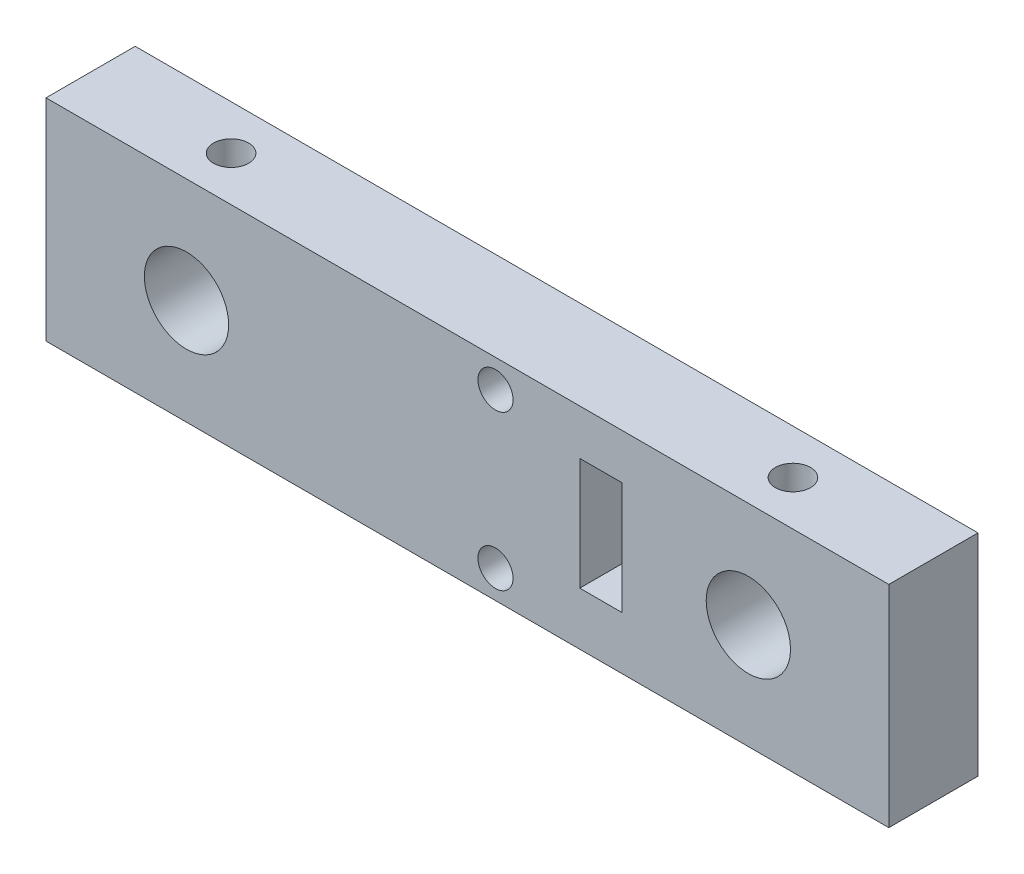
ISO-10303-21;
HEADER;
FILE_DESCRIPTION(('STEP AP214'),'2;1');
FILE_NAME('part.step','',(''),(''),'','','');
FILE_SCHEMA(('AUTOMOTIVE_DESIGN { 1 0 10303 214 1 1 1 1 }'));
ENDSEC;
DATA;
#1=APPLICATION_CONTEXT('core data for automotive mechanical design processes');
#2=APPLICATION_PROTOCOL_DEFINITION('international standard','automotive_design',2000,#1);
#3=PRODUCT_CONTEXT('',#1,'mechanical');
#4=PRODUCT('Part','Part','',(#3));
#5=PRODUCT_RELATED_PRODUCT_CATEGORY('part','',(#4));
#6=PRODUCT_DEFINITION_FORMATION('','',#4);
#7=PRODUCT_DEFINITION_CONTEXT('part definition',#1,'design');
#8=PRODUCT_DEFINITION('design','',#6,#7);
#9=PRODUCT_DEFINITION_SHAPE('','',#8);
#10=(LENGTH_UNIT() NAMED_UNIT(*) SI_UNIT(.MILLI.,.METRE.));
#11=(NAMED_UNIT(*) PLANE_ANGLE_UNIT() SI_UNIT($,.RADIAN.));
#12=(NAMED_UNIT(*) SI_UNIT($,.STERADIAN.) SOLID_ANGLE_UNIT());
#13=UNCERTAINTY_MEASURE_WITH_UNIT(LENGTH_MEASURE(1.E-05),#10,'distance_accuracy_value','');
#14=(GEOMETRIC_REPRESENTATION_CONTEXT(3) GLOBAL_UNCERTAINTY_ASSIGNED_CONTEXT((#13)) GLOBAL_UNIT_ASSIGNED_CONTEXT((#10,
#11,#12)) REPRESENTATION_CONTEXT('',''));
#15=CARTESIAN_POINT('',(0.,0.,0.));
#16=DIRECTION('',(0.,0.,1.));
#17=DIRECTION('',(1.,0.,0.));
#18=AXIS2_PLACEMENT_3D('',#15,#16,#17);
#19=CARTESIAN_POINT('',(0.,15.,6.35));
#20=DIRECTION('',(0.,0.,-1.));
#21=DIRECTION('',(-1.,0.,0.));
#22=AXIS2_PLACEMENT_3D('',#19,#20,#21);
#23=PLANE('',#22);
#24=CARTESIAN_POINT('',(32.,2.,6.35));
#25=DIRECTION('',(0.,0.,1.));
#26=DIRECTION('',(1.,0.,0.));
#27=AXIS2_PLACEMENT_3D('',#24,#25,#26);
#28=CIRCLE('',#27,1.24999999999999);
#29=CARTESIAN_POINT('',(33.25,2.,6.35));
#30=VERTEX_POINT('',#29);
#31=EDGE_CURVE('E279',#30,#30,#28,.T.);
#32=ORIENTED_EDGE('',*,*,#31,.F.);
#33=EDGE_LOOP('',(#32));
#34=FACE_BOUND('',#33,.T.);
#35=DIRECTION('',(1.,0.,0.));
#36=VECTOR('',#35,1.);
#37=CARTESIAN_POINT('',(38.,3.76931074562404,6.35));
#38=LINE('',#37,#36);
#39=CARTESIAN_POINT('',(38.,3.76931074562404,6.35));
#40=VERTEX_POINT('',#39);
#41=CARTESIAN_POINT('',(41.,3.76931074562404,6.35));
#42=VERTEX_POINT('',#41);
#43=EDGE_CURVE('E138',#40,#42,#38,.T.);
#44=ORIENTED_EDGE('',*,*,#43,.F.);
#45=DIRECTION('',(0.,-1.,0.));
#46=VECTOR('',#45,1.);
#47=CARTESIAN_POINT('',(38.,11.769310745624,6.35));
#48=LINE('',#47,#46);
#49=CARTESIAN_POINT('',(38.,11.769310745624,6.35));
#50=VERTEX_POINT('',#49);
#51=EDGE_CURVE('E58',#50,#40,#48,.T.);
#52=ORIENTED_EDGE('',*,*,#51,.F.);
#53=DIRECTION('',(-1.,0.,0.));
#54=VECTOR('',#53,1.);
#55=CARTESIAN_POINT('',(38.,11.769310745624,6.35));
#56=LINE('',#55,#54);
#57=CARTESIAN_POINT('',(41.,11.769310745624,6.35));
#58=VERTEX_POINT('',#57);
#59=EDGE_CURVE('E126',#58,#50,#56,.T.);
#60=ORIENTED_EDGE('',*,*,#59,.F.);
#61=DIRECTION('',(0.,1.,0.));
#62=VECTOR('',#61,1.);
#63=CARTESIAN_POINT('',(41.,11.769310745624,6.35));
#64=LINE('',#63,#62);
#65=EDGE_CURVE('E129',#42,#58,#64,.T.);
#66=ORIENTED_EDGE('',*,*,#65,.F.);
#67=EDGE_LOOP('',(#44,#52,#60,#66));
#68=FACE_BOUND('',#67,.T.);
#69=CARTESIAN_POINT('',(10.,7.5,6.35));
#70=DIRECTION('',(0.,0.,1.));
#71=DIRECTION('',(1.,0.,0.));
#72=AXIS2_PLACEMENT_3D('',#69,#70,#71);
#73=CIRCLE('',#72,3.);
#74=CARTESIAN_POINT('',(13.,7.5,6.35));
#75=VERTEX_POINT('',#74);
#76=EDGE_CURVE('E161',#75,#75,#73,.T.);
#77=ORIENTED_EDGE('',*,*,#76,.F.);
#78=EDGE_LOOP('',(#77));
#79=FACE_BOUND('',#78,.T.);
#80=DIRECTION('',(0.,-1.,0.));
#81=VECTOR('',#80,1.);
#82=CARTESIAN_POINT('',(0.,0.,6.35));
#83=LINE('',#82,#81);
#84=CARTESIAN_POINT('',(0.,15.,6.35));
#85=VERTEX_POINT('',#84);
#86=CARTESIAN_POINT('',(0.,0.,6.35));
#87=VERTEX_POINT('',#86);
#88=EDGE_CURVE('E167',#85,#87,#83,.T.);
#89=ORIENTED_EDGE('',*,*,#88,.T.);
#90=DIRECTION('',(1.,0.,0.));
#91=VECTOR('',#90,1.);
#92=CARTESIAN_POINT('',(0.,0.,6.35));
#93=LINE('',#92,#91);
#94=CARTESIAN_POINT('',(60.,0.,6.35));
#95=VERTEX_POINT('',#94);
#96=EDGE_CURVE('E170',#87,#95,#93,.T.);
#97=ORIENTED_EDGE('',*,*,#96,.T.);
#98=DIRECTION('',(0.,1.,0.));
#99=VECTOR('',#98,1.);
#100=CARTESIAN_POINT('',(60.,0.,6.35));
#101=LINE('',#100,#99);
#102=CARTESIAN_POINT('',(60.,15.,6.35));
#103=VERTEX_POINT('',#102);
#104=EDGE_CURVE('E173',#95,#103,#101,.T.);
#105=ORIENTED_EDGE('',*,*,#104,.T.);
#106=DIRECTION('',(-1.,0.,0.));
#107=VECTOR('',#106,1.);
#108=CARTESIAN_POINT('',(0.,15.,6.35));
#109=LINE('',#108,#107);
#110=EDGE_CURVE('E175',#103,#85,#109,.T.);
#111=ORIENTED_EDGE('',*,*,#110,.T.);
#112=EDGE_LOOP('',(#89,#97,#105,#111));
#113=FACE_BOUND('',#112,.T.);
#114=CARTESIAN_POINT('',(50.,7.5,6.35));
#115=DIRECTION('',(0.,0.,1.));
#116=DIRECTION('',(-1.,0.,0.));
#117=AXIS2_PLACEMENT_3D('',#114,#115,#116);
#118=CIRCLE('',#117,3.00000000000001);
#119=CARTESIAN_POINT('',(47.,7.5,6.35));
#120=VERTEX_POINT('',#119);
#121=EDGE_CURVE('E154',#120,#120,#118,.T.);
#122=ORIENTED_EDGE('',*,*,#121,.F.);
#123=EDGE_LOOP('',(#122));
#124=FACE_BOUND('',#123,.T.);
#125=CARTESIAN_POINT('',(32.,13.,6.35));
#126=DIRECTION('',(0.,0.,1.));
#127=DIRECTION('',(1.,0.,0.));
#128=AXIS2_PLACEMENT_3D('',#125,#126,#127);
#129=CIRCLE('',#128,1.24999999999999);
#130=CARTESIAN_POINT('',(33.25,13.,6.35));
#131=VERTEX_POINT('',#130);
#132=EDGE_CURVE('E275',#131,#131,#129,.T.);
#133=ORIENTED_EDGE('',*,*,#132,.F.);
#134=EDGE_LOOP('',(#133));
#135=FACE_BOUND('',#134,.T.);
#136=ADVANCED_FACE('F37',(#34,#68,#79,#113,#124,#135),#23,.F.);
#137=CARTESIAN_POINT('',(0.,15.,0.));
#138=DIRECTION('',(0.,0.,-1.));
#139=DIRECTION('',(-1.,0.,0.));
#140=AXIS2_PLACEMENT_3D('',#137,#138,#139);
#141=PLANE('',#140);
#142=CARTESIAN_POINT('',(32.,2.,0.));
#143=DIRECTION('',(0.,0.,1.));
#144=DIRECTION('',(1.,0.,0.));
#145=AXIS2_PLACEMENT_3D('',#142,#143,#144);
#146=CIRCLE('',#145,1.25);
#147=CARTESIAN_POINT('',(33.25,2.,0.));
#148=VERTEX_POINT('',#147);
#149=EDGE_CURVE('E132',#148,#148,#146,.T.);
#150=ORIENTED_EDGE('',*,*,#149,.T.);
#151=EDGE_LOOP('',(#150));
#152=FACE_BOUND('',#151,.T.);
#153=DIRECTION('',(0.,-1.,0.));
#154=VECTOR('',#153,1.);
#155=CARTESIAN_POINT('',(38.,11.769310745624,0.));
#156=LINE('',#155,#154);
#157=CARTESIAN_POINT('',(38.,11.769310745624,0.));
#158=VERTEX_POINT('',#157);
#159=CARTESIAN_POINT('',(38.,3.76931074562404,0.));
#160=VERTEX_POINT('',#159);
#161=EDGE_CURVE('E110',#158,#160,#156,.T.);
#162=ORIENTED_EDGE('',*,*,#161,.T.);
#163=DIRECTION('',(1.,0.,0.));
#164=VECTOR('',#163,1.);
#165=CARTESIAN_POINT('',(38.,3.76931074562404,0.));
#166=LINE('',#165,#164);
#167=CARTESIAN_POINT('',(41.,3.76931074562404,0.));
#168=VERTEX_POINT('',#167);
#169=EDGE_CURVE('E119',#160,#168,#166,.T.);
#170=ORIENTED_EDGE('',*,*,#169,.T.);
#171=DIRECTION('',(0.,1.,0.));
#172=VECTOR('',#171,1.);
#173=CARTESIAN_POINT('',(41.,11.769310745624,0.));
#174=LINE('',#173,#172);
#175=CARTESIAN_POINT('',(41.,11.769310745624,0.));
#176=VERTEX_POINT('',#175);
#177=EDGE_CURVE('E66',#168,#176,#174,.T.);
#178=ORIENTED_EDGE('',*,*,#177,.T.);
#179=DIRECTION('',(-1.,0.,0.));
#180=VECTOR('',#179,1.);
#181=CARTESIAN_POINT('',(38.,11.769310745624,0.));
#182=LINE('',#181,#180);
#183=EDGE_CURVE('E116',#176,#158,#182,.T.);
#184=ORIENTED_EDGE('',*,*,#183,.T.);
#185=EDGE_LOOP('',(#162,#170,#178,#184));
#186=FACE_BOUND('',#185,.T.);
#187=CARTESIAN_POINT('',(10.,7.5,0.));
#188=DIRECTION('',(0.,0.,1.));
#189=DIRECTION('',(1.,0.,0.));
#190=AXIS2_PLACEMENT_3D('',#187,#188,#189);
#191=CIRCLE('',#190,3.);
#192=CARTESIAN_POINT('',(13.,7.5,0.));
#193=VERTEX_POINT('',#192);
#194=EDGE_CURVE('E157',#193,#193,#191,.T.);
#195=ORIENTED_EDGE('',*,*,#194,.T.);
#196=EDGE_LOOP('',(#195));
#197=FACE_BOUND('',#196,.T.);
#198=DIRECTION('',(0.,-1.,0.));
#199=VECTOR('',#198,1.);
#200=CARTESIAN_POINT('',(0.,0.,0.));
#201=LINE('',#200,#199);
#202=CARTESIAN_POINT('',(0.,15.,0.));
#203=VERTEX_POINT('',#202);
#204=CARTESIAN_POINT('',(0.,0.,0.));
#205=VERTEX_POINT('',#204);
#206=EDGE_CURVE('E164',#203,#205,#201,.T.);
#207=ORIENTED_EDGE('',*,*,#206,.F.);
#208=DIRECTION('',(-1.,0.,0.));
#209=VECTOR('',#208,1.);
#210=CARTESIAN_POINT('',(0.,15.,0.));
#211=LINE('',#210,#209);
#212=CARTESIAN_POINT('',(60.,15.,0.));
#213=VERTEX_POINT('',#212);
#214=EDGE_CURVE('E171',#213,#203,#211,.T.);
#215=ORIENTED_EDGE('',*,*,#214,.F.);
#216=DIRECTION('',(0.,1.,0.));
#217=VECTOR('',#216,1.);
#218=CARTESIAN_POINT('',(60.,0.,0.));
#219=LINE('',#218,#217);
#220=CARTESIAN_POINT('',(60.,0.,0.));
#221=VERTEX_POINT('',#220);
#222=EDGE_CURVE('E182',#221,#213,#219,.T.);
#223=ORIENTED_EDGE('',*,*,#222,.F.);
#224=DIRECTION('',(1.,0.,0.));
#225=VECTOR('',#224,1.);
#226=CARTESIAN_POINT('',(0.,0.,0.));
#227=LINE('',#226,#225);
#228=EDGE_CURVE('E180',#205,#221,#227,.T.);
#229=ORIENTED_EDGE('',*,*,#228,.F.);
#230=EDGE_LOOP('',(#207,#215,#223,#229));
#231=FACE_BOUND('',#230,.T.);
#232=CARTESIAN_POINT('',(50.,7.5,0.));
#233=DIRECTION('',(0.,0.,1.));
#234=DIRECTION('',(-1.,0.,0.));
#235=AXIS2_PLACEMENT_3D('',#232,#233,#234);
#236=CIRCLE('',#235,3.00000000000001);
#237=CARTESIAN_POINT('',(47.,7.5,0.));
#238=VERTEX_POINT('',#237);
#239=EDGE_CURVE('E158',#238,#238,#236,.T.);
#240=ORIENTED_EDGE('',*,*,#239,.T.);
#241=EDGE_LOOP('',(#240));
#242=FACE_BOUND('',#241,.T.);
#243=CARTESIAN_POINT('',(32.,13.,0.));
#244=DIRECTION('',(0.,0.,1.));
#245=DIRECTION('',(1.,0.,0.));
#246=AXIS2_PLACEMENT_3D('',#243,#244,#245);
#247=CIRCLE('',#246,1.25);
#248=CARTESIAN_POINT('',(33.25,13.,0.));
#249=VERTEX_POINT('',#248);
#250=EDGE_CURVE('E276',#249,#249,#247,.T.);
#251=ORIENTED_EDGE('',*,*,#250,.T.);
#252=EDGE_LOOP('',(#251));
#253=FACE_BOUND('',#252,.T.);
#254=ADVANCED_FACE('F123',(#152,#186,#197,#231,#242,#253),#141,.T.);
#255=CARTESIAN_POINT('',(0.,0.,6.35));
#256=DIRECTION('',(1.,0.,0.));
#257=DIRECTION('',(0.,0.,-1.));
#258=AXIS2_PLACEMENT_3D('',#255,#256,#257);
#259=PLANE('',#258);
#260=ORIENTED_EDGE('',*,*,#206,.T.);
#261=DIRECTION('',(0.,0.,-1.));
#262=VECTOR('',#261,1.);
#263=CARTESIAN_POINT('',(0.,0.,6.35));
#264=LINE('',#263,#262);
#265=EDGE_CURVE('E11',#87,#205,#264,.T.);
#266=ORIENTED_EDGE('',*,*,#265,.F.);
#267=ORIENTED_EDGE('',*,*,#88,.F.);
#268=DIRECTION('',(0.,0.,-1.));
#269=VECTOR('',#268,1.);
#270=CARTESIAN_POINT('',(0.,15.,6.35));
#271=LINE('',#270,#269);
#272=EDGE_CURVE('E177',#85,#203,#271,.T.);
#273=ORIENTED_EDGE('',*,*,#272,.T.);
#274=EDGE_LOOP('',(#260,#266,#267,#273));
#275=FACE_BOUND('',#274,.T.);
#276=ADVANCED_FACE('F39',(#275),#259,.F.);
#277=CARTESIAN_POINT('',(0.,0.,6.35));
#278=DIRECTION('',(0.,1.,0.));
#279=DIRECTION('',(0.,0.,1.));
#280=AXIS2_PLACEMENT_3D('',#277,#278,#279);
#281=PLANE('',#280);
#282=ORIENTED_EDGE('',*,*,#228,.T.);
#283=DIRECTION('',(0.,0.,-1.));
#284=VECTOR('',#283,1.);
#285=CARTESIAN_POINT('',(60.,0.,6.35));
#286=LINE('',#285,#284);
#287=EDGE_CURVE('E50',#95,#221,#286,.T.);
#288=ORIENTED_EDGE('',*,*,#287,.F.);
#289=ORIENTED_EDGE('',*,*,#96,.F.);
#290=ORIENTED_EDGE('',*,*,#265,.T.);
#291=EDGE_LOOP('',(#282,#288,#289,#290));
#292=FACE_BOUND('',#291,.T.);
#293=ADVANCED_FACE('F248',(#292),#281,.F.);
#294=CARTESIAN_POINT('',(60.,0.,6.35));
#295=DIRECTION('',(-1.,0.,0.));
#296=DIRECTION('',(0.,0.,1.));
#297=AXIS2_PLACEMENT_3D('',#294,#295,#296);
#298=PLANE('',#297);
#299=ORIENTED_EDGE('',*,*,#222,.T.);
#300=DIRECTION('',(0.,0.,-1.));
#301=VECTOR('',#300,1.);
#302=CARTESIAN_POINT('',(60.,15.,6.35));
#303=LINE('',#302,#301);
#304=EDGE_CURVE('E187',#103,#213,#303,.T.);
#305=ORIENTED_EDGE('',*,*,#304,.F.);
#306=ORIENTED_EDGE('',*,*,#104,.F.);
#307=ORIENTED_EDGE('',*,*,#287,.T.);
#308=EDGE_LOOP('',(#299,#305,#306,#307));
#309=FACE_BOUND('',#308,.T.);
#310=ADVANCED_FACE('F245',(#309),#298,.F.);
#311=CARTESIAN_POINT('',(0.,15.,6.35));
#312=DIRECTION('',(0.,-1.,0.));
#313=DIRECTION('',(0.,0.,-1.));
#314=AXIS2_PLACEMENT_3D('',#311,#312,#313);
#315=PLANE('',#314);
#316=CARTESIAN_POINT('',(10.,15.,3.175));
#317=DIRECTION('',(0.,1.,0.));
#318=DIRECTION('',(0.,0.,1.));
#319=AXIS2_PLACEMENT_3D('',#316,#317,#318);
#320=CIRCLE('',#319,1.24999999999999);
#321=CARTESIAN_POINT('',(10.,15.,4.42499999999999));
#322=VERTEX_POINT('',#321);
#323=EDGE_CURVE('E144',#322,#322,#320,.T.);
#324=ORIENTED_EDGE('',*,*,#323,.F.);
#325=EDGE_LOOP('',(#324));
#326=FACE_BOUND('',#325,.T.);
#327=CARTESIAN_POINT('',(50.,15.,3.175));
#328=DIRECTION('',(0.,1.,0.));
#329=DIRECTION('',(0.,0.,1.));
#330=AXIS2_PLACEMENT_3D('',#327,#328,#329);
#331=CIRCLE('',#330,1.24999999999999);
#332=CARTESIAN_POINT('',(50.,15.,4.42499999999999));
#333=VERTEX_POINT('',#332);
#334=EDGE_CURVE('E150',#333,#333,#331,.T.);
#335=ORIENTED_EDGE('',*,*,#334,.F.);
#336=EDGE_LOOP('',(#335));
#337=FACE_BOUND('',#336,.T.);
#338=ORIENTED_EDGE('',*,*,#214,.T.);
#339=ORIENTED_EDGE('',*,*,#272,.F.);
#340=ORIENTED_EDGE('',*,*,#110,.F.);
#341=ORIENTED_EDGE('',*,*,#304,.T.);
#342=EDGE_LOOP('',(#338,#339,#340,#341));
#343=FACE_BOUND('',#342,.T.);
#344=ADVANCED_FACE('F242',(#326,#337,#343),#315,.F.);
#345=CARTESIAN_POINT('',(10.,7.5,6.35));
#346=DIRECTION('',(0.,0.,-1.));
#347=DIRECTION('',(-1.,0.,0.));
#348=AXIS2_PLACEMENT_3D('',#345,#346,#347);
#349=CYLINDRICAL_SURFACE('',#348,3.);
#350=CARTESIAN_POINT('',(10.,10.5,4.42499999999999));
#351=CARTESIAN_POINT('',(9.93304194736373,10.4999945836727,4.42499279490869));
#352=CARTESIAN_POINT('',(9.86597860293616,10.4977323297471,4.41958804147185));
#353=CARTESIAN_POINT('',(9.73375262884365,10.4889015357955,4.39816093507981));
#354=CARTESIAN_POINT('',(9.66859542357644,10.4823217590103,4.38211087553574));
#355=CARTESIAN_POINT('',(9.54231126634691,10.4655628903813,4.3400889082194));
#356=CARTESIAN_POINT('',(9.48117147557373,10.45539599975,4.31415061053184));
#357=CARTESIAN_POINT('',(9.3641702433202,10.4324528647066,4.25322717676742));
#358=CARTESIAN_POINT('',(9.30830720998406,10.4196774109285,4.21824478102912));
#359=CARTESIAN_POINT('',(9.20055159644049,10.3920782835187,4.13837101740911));
#360=CARTESIAN_POINT('',(9.14895873248224,10.3771875332609,4.09309869121024));
#361=CARTESIAN_POINT('',(9.05384017890874,10.3473271406851,3.99473566521742));
#362=CARTESIAN_POINT('',(9.01031873684692,10.3323574610681,3.94164087510548));
#363=CARTESIAN_POINT('',(8.93046262302935,10.30321021813,3.8259732224351));
#364=CARTESIAN_POINT('',(8.89458691846076,10.2891078687338,3.76306255157345));
#365=CARTESIAN_POINT('',(8.83406059411135,10.2643557235701,3.63142674207906));
#366=CARTESIAN_POINT('',(8.8094041916371,10.2537041500082,3.56270462051554));
#367=CARTESIAN_POINT('',(8.77325401687842,10.237785553877,3.42484630823207));
#368=CARTESIAN_POINT('',(8.76118342122395,10.2322838765179,3.35588951660784));
#369=CARTESIAN_POINT('',(8.74874790032205,10.226613262195,3.21672670731343));
#370=CARTESIAN_POINT('',(8.74837651945604,10.2264413842526,3.14652139997426));
#371=CARTESIAN_POINT('',(8.75891549636327,10.2312511956085,3.01259993956506));
#372=CARTESIAN_POINT('',(8.768963188877,10.2358388272362,2.94879890343554));
#373=CARTESIAN_POINT('',(8.79860808984224,10.248984827738,2.82388790899961));
#374=CARTESIAN_POINT('',(8.81820712712824,10.2575439570356,2.76277846850823));
#375=CARTESIAN_POINT('',(8.8667804127243,10.2778618477276,2.64344229700856));
#376=CARTESIAN_POINT('',(8.89594528460765,10.2896848194914,2.58530457908662));
#377=CARTESIAN_POINT('',(8.96268757419439,10.3151833114109,2.47452226611986));
#378=CARTESIAN_POINT('',(9.00026830948046,10.3288595612978,2.42187984938649));
#379=CARTESIAN_POINT('',(9.08650403445617,10.3579297687798,2.31890004126717));
#380=CARTESIAN_POINT('',(9.13582651679248,10.3733712140447,2.26913343261457));
#381=CARTESIAN_POINT('',(9.2422704089485,10.4032567311253,2.17838649704082));
#382=CARTESIAN_POINT('',(9.29939364055155,10.4177005687701,2.13740822830783));
#383=CARTESIAN_POINT('',(9.42155205130663,10.4443828355647,2.06456417638374));
#384=CARTESIAN_POINT('',(9.48673941755232,10.4565626654333,2.03293055484933));
#385=CARTESIAN_POINT('',(9.62214759747317,10.476894814148,1.98127886039675));
#386=CARTESIAN_POINT('',(9.69236560520497,10.485049358458,1.96125436805619));
#387=CARTESIAN_POINT('',(9.83107188665377,10.4959964118638,1.93458400787337));
#388=CARTESIAN_POINT('',(9.89938871472136,10.4990954104712,1.92717214255626));
#389=CARTESIAN_POINT('',(10.0363546554961,10.5005605036874,1.92365377638592));
#390=CARTESIAN_POINT('',(10.1050036671526,10.4989279571194,1.92754402974801));
#391=CARTESIAN_POINT('',(10.2370982423414,10.4913121765694,1.94597108480608));
#392=CARTESIAN_POINT('',(10.3006329666394,10.4855488728399,1.95996995409721));
#393=CARTESIAN_POINT('',(10.4243827489711,10.4704860677241,1.99746819454079));
#394=CARTESIAN_POINT('',(10.4845973865184,10.461186119597,2.02096876595031));
#395=CARTESIAN_POINT('',(10.6021089998691,10.4395827064517,2.07757097571213));
#396=CARTESIAN_POINT('',(10.6592572368553,10.4271949146928,2.11094818314604));
#397=CARTESIAN_POINT('',(10.7673462162314,10.4007380457909,2.1860533777917));
#398=CARTESIAN_POINT('',(10.8182843526019,10.3866682676873,2.22778485152928));
#399=CARTESIAN_POINT('',(10.9163334302743,10.3571208789544,2.32190323327242));
#400=CARTESIAN_POINT('',(10.9629106979798,10.3416145159103,2.37483850298627));
#401=CARTESIAN_POINT('',(11.0466698461055,10.3118433676801,2.4880212759354));
#402=CARTESIAN_POINT('',(11.0838495928562,10.2975788649344,2.54827043517174));
#403=CARTESIAN_POINT('',(11.148159602087,10.2718138624399,2.67561417530258));
#404=CARTESIAN_POINT('',(11.1751391823733,10.2603556255511,2.74279403551484));
#405=CARTESIAN_POINT('',(11.2171741395157,10.2420835565896,2.88137059381011));
#406=CARTESIAN_POINT('',(11.2322393486369,10.2352658955575,2.95276376248335));
#407=CARTESIAN_POINT('',(11.249040803489,10.2276316453726,3.09181869919921));
#408=CARTESIAN_POINT('',(11.2517138041313,10.2263935096716,3.15934466229262));
#409=CARTESIAN_POINT('',(11.2461557552391,10.2289385301102,3.2938428611411));
#410=CARTESIAN_POINT('',(11.2379263796472,10.2327209154031,3.36081518031369));
#411=CARTESIAN_POINT('',(11.2115840478049,10.2444955130227,3.48909274746889));
#412=CARTESIAN_POINT('',(11.1939490357146,10.2522835484648,3.55051667346339));
#413=CARTESIAN_POINT('',(11.1497632820213,10.2710318119919,3.66954802135722));
#414=CARTESIAN_POINT('',(11.1232100351725,10.2819929313169,3.72715436539878));
#415=CARTESIAN_POINT('',(11.0601028593549,10.3066695456001,3.84069589594912));
#416=CARTESIAN_POINT('',(11.0230436091048,10.3205110271368,3.89632233016829));
#417=CARTESIAN_POINT('',(10.9406840726304,10.3490368905384,4.00086013936068));
#418=CARTESIAN_POINT('',(10.8953809289056,10.3637215634587,4.04976917560057));
#419=CARTESIAN_POINT('',(10.7939020457788,10.3935639285011,4.14314868168474));
#420=CARTESIAN_POINT('',(10.737174739949,10.4086781751179,4.18703643284064));
#421=CARTESIAN_POINT('',(10.6166000792532,10.4366014362202,4.26469945354362));
#422=CARTESIAN_POINT('',(10.5527494979457,10.4494093991674,4.29847011488955));
#423=CARTESIAN_POINT('',(10.4207320567179,10.4710918336246,4.35420984543987));
#424=CARTESIAN_POINT('',(10.3526539909806,10.4800278258196,4.37636476661729));
#425=CARTESIAN_POINT('',(10.2134104218466,10.4932100976862,4.40870632907782));
#426=CARTESIAN_POINT('',(10.142255316981,10.4974710581197,4.41893044252987));
#427=CARTESIAN_POINT('',(10.0472360819192,10.4997228756893,4.42433316108643));
#428=CARTESIAN_POINT('',(10.0236245946757,10.5000019110254,4.42500254214921));
#429=CARTESIAN_POINT('',(10.,10.5,4.42499999999999));
#430=B_SPLINE_CURVE_WITH_KNOTS('',3,(#350,#351,#352,#353,#354,#355,#356,#357,#358,#359,#360,
#361,#362,#363,#364,#365,#366,#367,#368,#369,#370,#371,#372,#373,#374,#375,#376,#377,#378,#379,
#380,#381,#382,#383,#384,#385,#386,#387,#388,#389,#390,#391,#392,#393,#394,#395,#396,#397,#398,
#399,#400,#401,#402,#403,#404,#405,#406,#407,#408,#409,#410,#411,#412,#413,#414,#415,#416,#417,
#418,#419,#420,#421,#422,#423,#424,#425,#426,#427,#428,#429),.UNSPECIFIED.,.T.,.F.,(4,2,2,2,2,2,
2,2,2,2,2,2,2,2,2,2,2,2,2,2,2,2,2,2,2,2,2,2,2,2,2,2,2,2,2,2,2,2,2,4),(0.,0.200806918883936,
0.402138540628693,0.602791851906296,0.803384436852969,1.01317936288806,1.22308438131464,
1.44331724539124,1.66343646730586,1.87295273137556,2.08235338249044,2.27570157202555,
2.4690867972721,2.66658713058712,2.86416545717204,3.07844141127894,3.29276749314585,
3.5120405506081,3.73119224218294,3.93648443393248,4.14171767493168,4.33676589735718,
4.53183876601781,4.73297135272157,4.93418805469492,5.1497848802929,5.36543061240337,
5.58414788359519,5.80268447074576,6.00439877559639,6.20608211297531,6.39837649964757,
6.59072494950607,6.79463893397435,6.99862373425938,7.21746535004883,7.43640649428576,
7.65172855819379,7.86637250469315,7.93722256499091),.UNSPECIFIED.);
#431=CARTESIAN_POINT('',(10.,10.5,4.42499999999999));
#432=VERTEX_POINT('',#431);
#433=EDGE_CURVE('E41',#432,#432,#430,.T.);
#434=ORIENTED_EDGE('',*,*,#433,.F.);
#435=EDGE_LOOP('',(#434));
#436=FACE_BOUND('',#435,.T.);
#437=ORIENTED_EDGE('',*,*,#76,.T.);
#438=EDGE_LOOP('',(#437));
#439=FACE_BOUND('',#438,.T.);
#440=ORIENTED_EDGE('',*,*,#194,.F.);
#441=EDGE_LOOP('',(#440));
#442=FACE_BOUND('',#441,.T.);
#443=ADVANCED_FACE('F239',(#436,#439,#442),#349,.F.);
#444=CARTESIAN_POINT('',(50.,7.5,6.35));
#445=DIRECTION('',(0.,0.,-1.));
#446=DIRECTION('',(-1.,0.,0.));
#447=AXIS2_PLACEMENT_3D('',#444,#445,#446);
#448=CYLINDRICAL_SURFACE('',#447,3.00000000000001);
#449=CARTESIAN_POINT('',(50.,10.5,4.42499999999999));
#450=CARTESIAN_POINT('',(49.9330419473637,10.4999945836727,4.42499279490869));
#451=CARTESIAN_POINT('',(49.8659786029362,10.4977323297471,4.41958804147185));
#452=CARTESIAN_POINT('',(49.7337526288437,10.4889015357955,4.39816093507981));
#453=CARTESIAN_POINT('',(49.6685954235764,10.4823217590103,4.38211087553574));
#454=CARTESIAN_POINT('',(49.5423112663469,10.4655628903813,4.3400889082194));
#455=CARTESIAN_POINT('',(49.4811714755737,10.45539599975,4.31415061053184));
#456=CARTESIAN_POINT('',(49.3641702433202,10.4324528647066,4.25322717676742));
#457=CARTESIAN_POINT('',(49.3083072099841,10.4196774109285,4.21824478102912));
#458=CARTESIAN_POINT('',(49.2005515964405,10.3920782835187,4.13837101740911));
#459=CARTESIAN_POINT('',(49.1489587324822,10.3771875332609,4.09309869121023));
#460=CARTESIAN_POINT('',(49.0538401789087,10.3473271406851,3.99473566521742));
#461=CARTESIAN_POINT('',(49.0103187368469,10.3323574610681,3.94164087510548));
#462=CARTESIAN_POINT('',(48.9304626230294,10.30321021813,3.8259732224351));
#463=CARTESIAN_POINT('',(48.8945869184608,10.2891078687339,3.76306255157345));
#464=CARTESIAN_POINT('',(48.8340605941114,10.2643557235701,3.63142674207906));
#465=CARTESIAN_POINT('',(48.8094041916371,10.2537041500082,3.56270462051554));
#466=CARTESIAN_POINT('',(48.7732540168784,10.2377855538771,3.42484630823208));
#467=CARTESIAN_POINT('',(48.761183421224,10.2322838765179,3.35588951660785));
#468=CARTESIAN_POINT('',(48.7487479003221,10.2266132621951,3.21672670731343));
#469=CARTESIAN_POINT('',(48.748376519456,10.2264413842526,3.14652139997426));
#470=CARTESIAN_POINT('',(48.7589154963633,10.2312511956085,3.01259993956506));
#471=CARTESIAN_POINT('',(48.768963188877,10.2358388272362,2.94879890343554));
#472=CARTESIAN_POINT('',(48.7986080898422,10.248984827738,2.82388790899961));
#473=CARTESIAN_POINT('',(48.8182071271282,10.2575439570356,2.76277846850823));
#474=CARTESIAN_POINT('',(48.8667804127243,10.2778618477276,2.64344229700856));
#475=CARTESIAN_POINT('',(48.8959452846077,10.2896848194914,2.58530457908662));
#476=CARTESIAN_POINT('',(48.9626875741944,10.3151833114109,2.47452226611986));
#477=CARTESIAN_POINT('',(49.0002683094805,10.3288595612978,2.42187984938649));
#478=CARTESIAN_POINT('',(49.0865040344562,10.3579297687798,2.31890004126717));
#479=CARTESIAN_POINT('',(49.1358265167925,10.3733712140447,2.26913343261457));
#480=CARTESIAN_POINT('',(49.2422704089485,10.4032567311253,2.17838649704083));
#481=CARTESIAN_POINT('',(49.2993936405515,10.4177005687701,2.13740822830783));
#482=CARTESIAN_POINT('',(49.4215520513066,10.4443828355647,2.06456417638374));
#483=CARTESIAN_POINT('',(49.4867394175523,10.4565626654333,2.03293055484933));
#484=CARTESIAN_POINT('',(49.6221475974732,10.476894814148,1.98127886039675));
#485=CARTESIAN_POINT('',(49.692365605205,10.485049358458,1.96125436805619));
#486=CARTESIAN_POINT('',(49.8310718866538,10.4959964118639,1.93458400787337));
#487=CARTESIAN_POINT('',(49.8993887147214,10.4990954104713,1.92717214255626));
#488=CARTESIAN_POINT('',(50.0363546554961,10.5005605036875,1.92365377638592));
#489=CARTESIAN_POINT('',(50.1050036671526,10.4989279571194,1.92754402974801));
#490=CARTESIAN_POINT('',(50.2370982423414,10.4913121765694,1.94597108480608));
#491=CARTESIAN_POINT('',(50.3006329666394,10.4855488728399,1.95996995409721));
#492=CARTESIAN_POINT('',(50.4243827489711,10.4704860677242,1.99746819454079));
#493=CARTESIAN_POINT('',(50.4845973865184,10.461186119597,2.02096876595031));
#494=CARTESIAN_POINT('',(50.6021089998691,10.4395827064517,2.07757097571213));
#495=CARTESIAN_POINT('',(50.6592572368553,10.4271949146928,2.11094818314604));
#496=CARTESIAN_POINT('',(50.7673462162314,10.4007380457909,2.18605337779171));
#497=CARTESIAN_POINT('',(50.8182843526019,10.3866682676873,2.22778485152929));
#498=CARTESIAN_POINT('',(50.9163334302743,10.3571208789544,2.32190323327242));
#499=CARTESIAN_POINT('',(50.9629106979798,10.3416145159103,2.37483850298627));
#500=CARTESIAN_POINT('',(51.0466698461055,10.3118433676801,2.4880212759354));
#501=CARTESIAN_POINT('',(51.0838495928562,10.2975788649344,2.54827043517174));
#502=CARTESIAN_POINT('',(51.148159602087,10.2718138624399,2.67561417530258));
#503=CARTESIAN_POINT('',(51.1751391823733,10.2603556255511,2.74279403551484));
#504=CARTESIAN_POINT('',(51.2171741395157,10.2420835565896,2.88137059381011));
#505=CARTESIAN_POINT('',(51.2322393486369,10.2352658955575,2.95276376248335));
#506=CARTESIAN_POINT('',(51.249040803489,10.2276316453727,3.09181869919921));
#507=CARTESIAN_POINT('',(51.2517138041313,10.2263935096716,3.15934466229262));
#508=CARTESIAN_POINT('',(51.2461557552391,10.2289385301103,3.2938428611411));
#509=CARTESIAN_POINT('',(51.2379263796472,10.2327209154031,3.36081518031369));
#510=CARTESIAN_POINT('',(51.2115840478049,10.2444955130227,3.48909274746889));
#511=CARTESIAN_POINT('',(51.1939490357147,10.2522835484648,3.55051667346339));
#512=CARTESIAN_POINT('',(51.1497632820213,10.2710318119919,3.66954802135723));
#513=CARTESIAN_POINT('',(51.1232100351725,10.2819929313169,3.72715436539878));
#514=CARTESIAN_POINT('',(51.0601028593549,10.3066695456001,3.84069589594912));
#515=CARTESIAN_POINT('',(51.0230436091048,10.3205110271368,3.89632233016828));
#516=CARTESIAN_POINT('',(50.9406840726304,10.3490368905384,4.00086013936067));
#517=CARTESIAN_POINT('',(50.8953809289056,10.3637215634588,4.04976917560057));
#518=CARTESIAN_POINT('',(50.7939020457788,10.3935639285011,4.14314868168473));
#519=CARTESIAN_POINT('',(50.737174739949,10.4086781751179,4.18703643284064));
#520=CARTESIAN_POINT('',(50.6166000792532,10.4366014362202,4.26469945354361));
#521=CARTESIAN_POINT('',(50.5527494979457,10.4494093991674,4.29847011488954));
#522=CARTESIAN_POINT('',(50.4207320567179,10.4710918336246,4.35420984543987));
#523=CARTESIAN_POINT('',(50.3526539909806,10.4800278258196,4.37636476661729));
#524=CARTESIAN_POINT('',(50.2134104218466,10.4932100976863,4.40870632907782));
#525=CARTESIAN_POINT('',(50.142255316981,10.4974710581197,4.41893044252987));
#526=CARTESIAN_POINT('',(50.0472360819192,10.4997228756893,4.42433316108643));
#527=CARTESIAN_POINT('',(50.0236245946757,10.5000019110254,4.42500254214921));
#528=CARTESIAN_POINT('',(50.,10.5,4.42499999999999));
#529=B_SPLINE_CURVE_WITH_KNOTS('',3,(#449,#450,#451,#452,#453,#454,#455,#456,#457,#458,#459,
#460,#461,#462,#463,#464,#465,#466,#467,#468,#469,#470,#471,#472,#473,#474,#475,#476,#477,#478,
#479,#480,#481,#482,#483,#484,#485,#486,#487,#488,#489,#490,#491,#492,#493,#494,#495,#496,#497,
#498,#499,#500,#501,#502,#503,#504,#505,#506,#507,#508,#509,#510,#511,#512,#513,#514,#515,#516,
#517,#518,#519,#520,#521,#522,#523,#524,#525,#526,#527,#528),.UNSPECIFIED.,.T.,.F.,(4,2,2,2,2,2,
2,2,2,2,2,2,2,2,2,2,2,2,2,2,2,2,2,2,2,2,2,2,2,2,2,2,2,2,2,2,2,2,2,4),(0.,0.200806918883936,
0.402138540628691,0.602791851906306,0.803384436852966,1.01317936288806,1.22308438131465,
1.44331724539124,1.66343646730586,1.87295273137555,2.08235338249044,2.27570157202554,
2.4690867972721,2.66658713058712,2.86416545717204,3.07844141127894,3.29276749314585,
3.5120405506081,3.73119224218293,3.93648443393248,4.14171767493168,4.33676589735717,
4.5318387660178,4.73297135272156,4.93418805469491,5.14978488029289,5.36543061240336,
5.58414788359518,5.80268447074574,6.00439877559638,6.2060821129753,6.39837649964756,
6.59072494950606,6.79463893397434,6.99862373425937,7.21746535004882,7.43640649428575,
7.65172855819378,7.86637250469314,7.9372225649909),.UNSPECIFIED.);
#530=CARTESIAN_POINT('',(50.,10.5,4.42499999999999));
#531=VERTEX_POINT('',#530);
#532=EDGE_CURVE('E153',#531,#531,#529,.T.);
#533=ORIENTED_EDGE('',*,*,#532,.F.);
#534=EDGE_LOOP('',(#533));
#535=FACE_BOUND('',#534,.T.);
#536=ORIENTED_EDGE('',*,*,#121,.T.);
#537=EDGE_LOOP('',(#536));
#538=FACE_BOUND('',#537,.T.);
#539=ORIENTED_EDGE('',*,*,#239,.F.);
#540=EDGE_LOOP('',(#539));
#541=FACE_BOUND('',#540,.T.);
#542=ADVANCED_FACE('F196',(#535,#538,#541),#448,.F.);
#543=CARTESIAN_POINT('',(50.,15.,3.175));
#544=DIRECTION('',(0.,1.,0.));
#545=DIRECTION('',(0.,0.,1.));
#546=AXIS2_PLACEMENT_3D('',#543,#544,#545);
#547=CYLINDRICAL_SURFACE('',#546,1.24999999999999);
#548=ORIENTED_EDGE('',*,*,#532,.T.);
#549=EDGE_LOOP('',(#548));
#550=FACE_BOUND('',#549,.T.);
#551=ORIENTED_EDGE('',*,*,#334,.T.);
#552=EDGE_LOOP('',(#551));
#553=FACE_BOUND('',#552,.T.);
#554=ADVANCED_FACE('F198',(#550,#553),#547,.F.);
#555=CARTESIAN_POINT('',(10.,15.,3.175));
#556=DIRECTION('',(0.,1.,0.));
#557=DIRECTION('',(0.,0.,1.));
#558=AXIS2_PLACEMENT_3D('',#555,#556,#557);
#559=CYLINDRICAL_SURFACE('',#558,1.24999999999999);
#560=ORIENTED_EDGE('',*,*,#433,.T.);
#561=EDGE_LOOP('',(#560));
#562=FACE_BOUND('',#561,.T.);
#563=ORIENTED_EDGE('',*,*,#323,.T.);
#564=EDGE_LOOP('',(#563));
#565=FACE_BOUND('',#564,.T.);
#566=ADVANCED_FACE('F201',(#562,#565),#559,.F.);
#567=CARTESIAN_POINT('',(38.,11.769310745624,0.));
#568=DIRECTION('',(-1.,0.,0.));
#569=DIRECTION('',(0.,0.,1.));
#570=AXIS2_PLACEMENT_3D('',#567,#568,#569);
#571=PLANE('',#570);
#572=ORIENTED_EDGE('',*,*,#51,.T.);
#573=DIRECTION('',(0.,0.,1.));
#574=VECTOR('',#573,1.);
#575=CARTESIAN_POINT('',(38.,3.76931074562404,0.));
#576=LINE('',#575,#574);
#577=EDGE_CURVE('E106',#160,#40,#576,.T.);
#578=ORIENTED_EDGE('',*,*,#577,.F.);
#579=ORIENTED_EDGE('',*,*,#161,.F.);
#580=DIRECTION('',(0.,0.,1.));
#581=VECTOR('',#580,1.);
#582=CARTESIAN_POINT('',(38.,11.769310745624,0.));
#583=LINE('',#582,#581);
#584=EDGE_CURVE('E142',#158,#50,#583,.T.);
#585=ORIENTED_EDGE('',*,*,#584,.T.);
#586=EDGE_LOOP('',(#572,#578,#579,#585));
#587=FACE_BOUND('',#586,.T.);
#588=ADVANCED_FACE('F108',(#587),#571,.F.);
#589=CARTESIAN_POINT('',(38.,11.769310745624,0.));
#590=DIRECTION('',(0.,1.,0.));
#591=DIRECTION('',(0.,0.,1.));
#592=AXIS2_PLACEMENT_3D('',#589,#590,#591);
#593=PLANE('',#592);
#594=ORIENTED_EDGE('',*,*,#59,.T.);
#595=ORIENTED_EDGE('',*,*,#584,.F.);
#596=ORIENTED_EDGE('',*,*,#183,.F.);
#597=DIRECTION('',(0.,0.,1.));
#598=VECTOR('',#597,1.);
#599=CARTESIAN_POINT('',(41.,11.769310745624,0.));
#600=LINE('',#599,#598);
#601=EDGE_CURVE('E145',#176,#58,#600,.T.);
#602=ORIENTED_EDGE('',*,*,#601,.T.);
#603=EDGE_LOOP('',(#594,#595,#596,#602));
#604=FACE_BOUND('',#603,.T.);
#605=ADVANCED_FACE('F209',(#604),#593,.F.);
#606=CARTESIAN_POINT('',(41.,11.769310745624,0.));
#607=DIRECTION('',(1.,0.,0.));
#608=DIRECTION('',(0.,0.,-1.));
#609=AXIS2_PLACEMENT_3D('',#606,#607,#608);
#610=PLANE('',#609);
#611=ORIENTED_EDGE('',*,*,#65,.T.);
#612=ORIENTED_EDGE('',*,*,#601,.F.);
#613=ORIENTED_EDGE('',*,*,#177,.F.);
#614=DIRECTION('',(0.,0.,1.));
#615=VECTOR('',#614,1.);
#616=CARTESIAN_POINT('',(41.,3.76931074562404,0.));
#617=LINE('',#616,#615);
#618=EDGE_CURVE('E115',#168,#42,#617,.T.);
#619=ORIENTED_EDGE('',*,*,#618,.T.);
#620=EDGE_LOOP('',(#611,#612,#613,#619));
#621=FACE_BOUND('',#620,.T.);
#622=ADVANCED_FACE('F213',(#621),#610,.F.);
#623=CARTESIAN_POINT('',(38.,3.76931074562404,0.));
#624=DIRECTION('',(0.,-1.,0.));
#625=DIRECTION('',(0.,0.,-1.));
#626=AXIS2_PLACEMENT_3D('',#623,#624,#625);
#627=PLANE('',#626);
#628=ORIENTED_EDGE('',*,*,#43,.T.);
#629=ORIENTED_EDGE('',*,*,#618,.F.);
#630=ORIENTED_EDGE('',*,*,#169,.F.);
#631=ORIENTED_EDGE('',*,*,#577,.T.);
#632=EDGE_LOOP('',(#628,#629,#630,#631));
#633=FACE_BOUND('',#632,.T.);
#634=ADVANCED_FACE('F120',(#633),#627,.F.);
#635=CARTESIAN_POINT('',(32.,2.,6.35));
#636=DIRECTION('',(0.,0.,1.));
#637=DIRECTION('',(1.,0.,0.));
#638=AXIS2_PLACEMENT_3D('',#635,#636,#637);
#639=CYLINDRICAL_SURFACE('',#638,1.24999999999999);
#640=ORIENTED_EDGE('',*,*,#149,.F.);
#641=EDGE_LOOP('',(#640));
#642=FACE_BOUND('',#641,.T.);
#643=ORIENTED_EDGE('',*,*,#31,.T.);
#644=EDGE_LOOP('',(#643));
#645=FACE_BOUND('',#644,.T.);
#646=ADVANCED_FACE('F212',(#642,#645),#639,.F.);
#647=CARTESIAN_POINT('',(32.,13.,6.35));
#648=DIRECTION('',(0.,0.,1.));
#649=DIRECTION('',(1.,0.,0.));
#650=AXIS2_PLACEMENT_3D('',#647,#648,#649);
#651=CYLINDRICAL_SURFACE('',#650,1.24999999999999);
#652=ORIENTED_EDGE('',*,*,#250,.F.);
#653=EDGE_LOOP('',(#652));
#654=FACE_BOUND('',#653,.T.);
#655=ORIENTED_EDGE('',*,*,#132,.T.);
#656=EDGE_LOOP('',(#655));
#657=FACE_BOUND('',#656,.T.);
#658=ADVANCED_FACE('F221',(#654,#657),#651,.F.);
#659=CLOSED_SHELL('',(#136,#254,#276,#293,#310,#344,#443,#542,#554,#566,#588,#605,#622,#634,
#646,#658));
#660=MANIFOLD_SOLID_BREP('B2',#659);
#661=ADVANCED_BREP_SHAPE_REPRESENTATION('',(#18,#660),#14);
#662=SHAPE_DEFINITION_REPRESENTATION(#9,#661);
ENDSEC;
END-ISO-10303-21;
